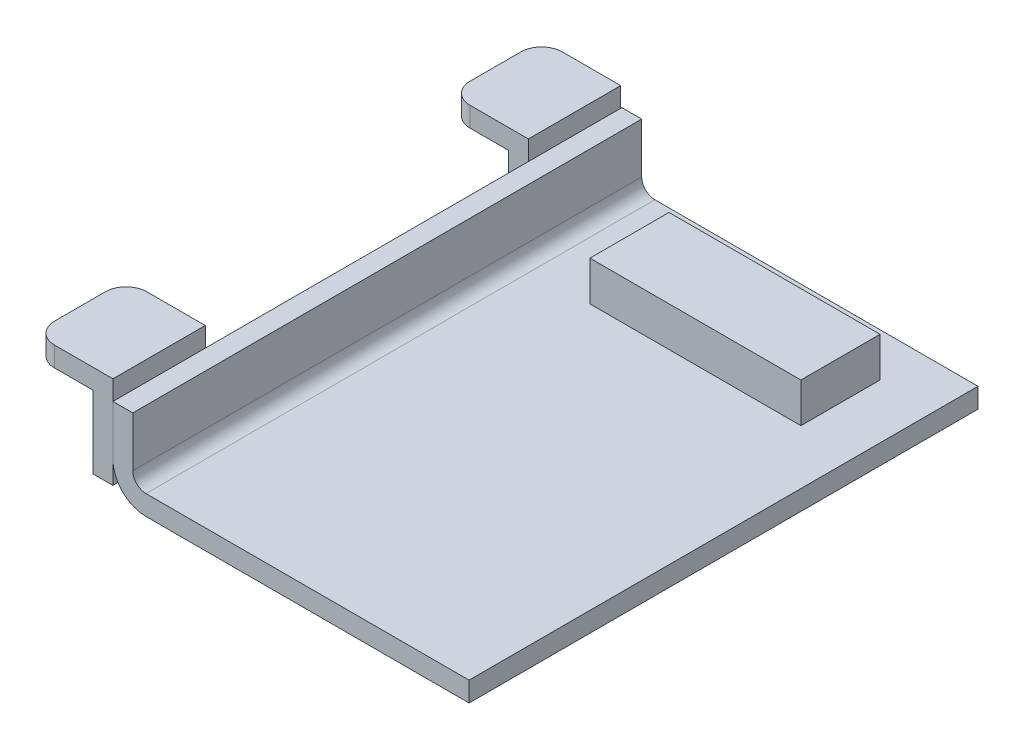
ISO-10303-21;
HEADER;
FILE_DESCRIPTION(('STEP AP214'),'2;1');
FILE_NAME('part.step','',(''),(''),'','','');
FILE_SCHEMA(('AUTOMOTIVE_DESIGN { 1 0 10303 214 1 1 1 1 }'));
ENDSEC;
DATA;
#1=APPLICATION_CONTEXT('core data for automotive mechanical design processes');
#2=APPLICATION_PROTOCOL_DEFINITION('international standard','automotive_design',2000,#1);
#3=PRODUCT_CONTEXT('',#1,'mechanical');
#4=PRODUCT('Part','Part','',(#3));
#5=PRODUCT_RELATED_PRODUCT_CATEGORY('part','',(#4));
#6=PRODUCT_DEFINITION_FORMATION('','',#4);
#7=PRODUCT_DEFINITION_CONTEXT('part definition',#1,'design');
#8=PRODUCT_DEFINITION('design','',#6,#7);
#9=PRODUCT_DEFINITION_SHAPE('','',#8);
#10=(LENGTH_UNIT() NAMED_UNIT(*) SI_UNIT(.MILLI.,.METRE.));
#11=(NAMED_UNIT(*) PLANE_ANGLE_UNIT() SI_UNIT($,.RADIAN.));
#12=(NAMED_UNIT(*) SI_UNIT($,.STERADIAN.) SOLID_ANGLE_UNIT());
#13=UNCERTAINTY_MEASURE_WITH_UNIT(LENGTH_MEASURE(1.E-05),#10,'distance_accuracy_value','');
#14=(GEOMETRIC_REPRESENTATION_CONTEXT(3) GLOBAL_UNCERTAINTY_ASSIGNED_CONTEXT((#13)) GLOBAL_UNIT_ASSIGNED_CONTEXT((#10,
#11,#12)) REPRESENTATION_CONTEXT('',''));
#15=CARTESIAN_POINT('',(0.,0.,0.));
#16=DIRECTION('',(0.,0.,1.));
#17=DIRECTION('',(1.,0.,0.));
#18=AXIS2_PLACEMENT_3D('',#15,#16,#17);
#19=CARTESIAN_POINT('',(-4.7752,2.49989999999999,61.25));
#20=DIRECTION('',(0.,-1.,0.));
#21=DIRECTION('',(1.,0.,0.));
#22=AXIS2_PLACEMENT_3D('',#19,#20,#21);
#23=PLANE('',#22);
#24=DIRECTION('',(-1.,0.,0.));
#25=VECTOR('',#24,1.);
#26=CARTESIAN_POINT('',(-4.7752,2.49989999999999,39.025));
#27=LINE('',#26,#25);
#28=CARTESIAN_POINT('',(0.,2.49989999999999,39.025));
#29=VERTEX_POINT('',#28);
#30=CARTESIAN_POINT('',(-4.7752,2.49989999999999,39.025));
#31=VERTEX_POINT('',#30);
#32=EDGE_CURVE('E145',#29,#31,#27,.T.);
#33=ORIENTED_EDGE('',*,*,#32,.F.);
#34=DIRECTION('',(0.,0.,-1.));
#35=VECTOR('',#34,1.);
#36=CARTESIAN_POINT('',(0.,2.49989999999999,61.25));
#37=LINE('',#36,#35);
#38=CARTESIAN_POINT('',(0.,2.49989999999999,61.25));
#39=VERTEX_POINT('',#38);
#40=EDGE_CURVE('E134',#39,#29,#37,.T.);
#41=ORIENTED_EDGE('',*,*,#40,.F.);
#42=DIRECTION('',(-1.,0.,0.));
#43=VECTOR('',#42,1.);
#44=CARTESIAN_POINT('',(-4.7752,2.49989999999999,61.25));
#45=LINE('',#44,#43);
#46=CARTESIAN_POINT('',(-4.7752,2.49989999999999,61.25));
#47=VERTEX_POINT('',#46);
#48=EDGE_CURVE('E130',#39,#47,#45,.T.);
#49=ORIENTED_EDGE('',*,*,#48,.T.);
#50=DIRECTION('',(0.,0.,-1.));
#51=VECTOR('',#50,1.);
#52=CARTESIAN_POINT('',(-4.7752,2.49989999999999,61.25));
#53=LINE('',#52,#51);
#54=EDGE_CURVE('E114',#47,#31,#53,.T.);
#55=ORIENTED_EDGE('',*,*,#54,.T.);
#56=EDGE_LOOP('',(#33,#41,#49,#55));
#57=FACE_BOUND('',#56,.T.);
#58=ADVANCED_FACE('F45',(#57),#23,.T.);
#59=CARTESIAN_POINT('',(0.,2.49989999999999,61.25));
#60=DIRECTION('',(1.,0.,0.));
#61=DIRECTION('',(0.,0.,-1.));
#62=AXIS2_PLACEMENT_3D('',#59,#60,#61);
#63=PLANE('',#62);
#64=DIRECTION('',(0.,-1.,0.));
#65=VECTOR('',#64,1.);
#66=CARTESIAN_POINT('',(0.,2.49989999999999,39.025));
#67=LINE('',#66,#65);
#68=CARTESIAN_POINT('',(0.,24.7249,39.025));
#69=VERTEX_POINT('',#68);
#70=EDGE_CURVE('E135',#69,#29,#67,.T.);
#71=ORIENTED_EDGE('',*,*,#70,.F.);
#72=DIRECTION('',(0.,0.,-1.));
#73=VECTOR('',#72,1.);
#74=CARTESIAN_POINT('',(0.,24.7249,61.25));
#75=LINE('',#74,#73);
#76=CARTESIAN_POINT('',(0.,24.7249,61.25));
#77=VERTEX_POINT('',#76);
#78=EDGE_CURVE('E153',#77,#69,#75,.T.);
#79=ORIENTED_EDGE('',*,*,#78,.F.);
#80=DIRECTION('',(0.,-1.,0.));
#81=VECTOR('',#80,1.);
#82=CARTESIAN_POINT('',(0.,2.49989999999999,61.25));
#83=LINE('',#82,#81);
#84=EDGE_CURVE('E125',#77,#39,#83,.T.);
#85=ORIENTED_EDGE('',*,*,#84,.T.);
#86=ORIENTED_EDGE('',*,*,#40,.T.);
#87=EDGE_LOOP('',(#71,#79,#85,#86));
#88=FACE_BOUND('',#87,.T.);
#89=ADVANCED_FACE('F186',(#88),#63,.T.);
#90=CARTESIAN_POINT('',(0.,24.7249,61.25));
#91=DIRECTION('',(0.,1.,0.));
#92=DIRECTION('',(0.,0.,1.));
#93=AXIS2_PLACEMENT_3D('',#90,#91,#92);
#94=PLANE('',#93);
#95=DIRECTION('',(0.,0.,-1.));
#96=VECTOR('',#95,1.);
#97=CARTESIAN_POINT('',(-19.05,24.7249,61.25));
#98=LINE('',#97,#96);
#99=CARTESIAN_POINT('',(-19.05,24.7249,56.25));
#100=VERTEX_POINT('',#99);
#101=CARTESIAN_POINT('',(-19.05,24.7249,44.025));
#102=VERTEX_POINT('',#101);
#103=EDGE_CURVE('E156',#100,#102,#98,.T.);
#104=ORIENTED_EDGE('',*,*,#103,.F.);
#105=CARTESIAN_POINT('',(-14.05,24.7249,56.25));
#106=DIRECTION('',(0.,1.,0.));
#107=DIRECTION('',(0.,0.,1.));
#108=AXIS2_PLACEMENT_3D('',#105,#106,#107);
#109=CIRCLE('',#108,5.);
#110=CARTESIAN_POINT('',(-14.05,24.7249,61.25));
#111=VERTEX_POINT('',#110);
#112=EDGE_CURVE('E168',#100,#111,#109,.T.);
#113=ORIENTED_EDGE('',*,*,#112,.T.);
#114=DIRECTION('',(1.,0.,0.));
#115=VECTOR('',#114,1.);
#116=CARTESIAN_POINT('',(0.,24.7249,61.25));
#117=LINE('',#116,#115);
#118=EDGE_CURVE('E142',#111,#77,#117,.T.);
#119=ORIENTED_EDGE('',*,*,#118,.T.);
#120=ORIENTED_EDGE('',*,*,#78,.T.);
#121=DIRECTION('',(1.,0.,0.));
#122=VECTOR('',#121,1.);
#123=CARTESIAN_POINT('',(0.,24.7249,39.025));
#124=LINE('',#123,#122);
#125=CARTESIAN_POINT('',(-14.05,24.7249,39.025));
#126=VERTEX_POINT('',#125);
#127=EDGE_CURVE('E138',#126,#69,#124,.T.);
#128=ORIENTED_EDGE('',*,*,#127,.F.);
#129=CARTESIAN_POINT('',(-14.05,24.7249,44.025));
#130=DIRECTION('',(0.,1.,0.));
#131=DIRECTION('',(0.,0.,1.));
#132=AXIS2_PLACEMENT_3D('',#129,#130,#131);
#133=CIRCLE('',#132,5.);
#134=EDGE_CURVE('E166',#126,#102,#133,.T.);
#135=ORIENTED_EDGE('',*,*,#134,.T.);
#136=EDGE_LOOP('',(#104,#113,#119,#120,#128,#135));
#137=FACE_BOUND('',#136,.T.);
#138=ADVANCED_FACE('F182',(#137),#94,.T.);
#139=CARTESIAN_POINT('',(-19.05,24.7249,61.25));
#140=DIRECTION('',(-1.,0.,0.));
#141=DIRECTION('',(0.,0.,1.));
#142=AXIS2_PLACEMENT_3D('',#139,#140,#141);
#143=PLANE('',#142);
#144=DIRECTION('',(0.,0.,-1.));
#145=VECTOR('',#144,1.);
#146=CARTESIAN_POINT('',(-19.05,19.9497,61.25));
#147=LINE('',#146,#145);
#148=CARTESIAN_POINT('',(-19.05,19.9497,56.25));
#149=VERTEX_POINT('',#148);
#150=CARTESIAN_POINT('',(-19.05,19.9497,44.025));
#151=VERTEX_POINT('',#150);
#152=EDGE_CURVE('E159',#149,#151,#147,.T.);
#153=ORIENTED_EDGE('',*,*,#152,.F.);
#154=DIRECTION('',(0.,1.,0.));
#155=VECTOR('',#154,1.);
#156=CARTESIAN_POINT('',(-19.05,24.7249,56.25));
#157=LINE('',#156,#155);
#158=EDGE_CURVE('E163',#149,#100,#157,.T.);
#159=ORIENTED_EDGE('',*,*,#158,.T.);
#160=ORIENTED_EDGE('',*,*,#103,.T.);
#161=DIRECTION('',(0.,1.,0.));
#162=VECTOR('',#161,1.);
#163=CARTESIAN_POINT('',(-19.05,24.7249,44.025));
#164=LINE('',#163,#162);
#165=EDGE_CURVE('E152',#102,#151,#164,.F.);
#166=ORIENTED_EDGE('',*,*,#165,.T.);
#167=EDGE_LOOP('',(#153,#159,#160,#166));
#168=FACE_BOUND('',#167,.T.);
#169=ADVANCED_FACE('F177',(#168),#143,.T.);
#170=CARTESIAN_POINT('',(-19.05,19.9497,61.25));
#171=DIRECTION('',(0.,-1.,0.));
#172=DIRECTION('',(1.,0.,0.));
#173=AXIS2_PLACEMENT_3D('',#170,#171,#172);
#174=PLANE('',#173);
#175=DIRECTION('',(-1.,0.,0.));
#176=VECTOR('',#175,1.);
#177=CARTESIAN_POINT('',(-19.05,19.9497,61.25));
#178=LINE('',#177,#176);
#179=CARTESIAN_POINT('',(-4.7752,19.9497,61.25));
#180=VERTEX_POINT('',#179);
#181=CARTESIAN_POINT('',(-14.05,19.9497,61.25));
#182=VERTEX_POINT('',#181);
#183=EDGE_CURVE('E132',#180,#182,#178,.T.);
#184=ORIENTED_EDGE('',*,*,#183,.T.);
#185=CARTESIAN_POINT('',(-14.05,19.9497,56.25));
#186=DIRECTION('',(0.,-1.,0.));
#187=DIRECTION('',(1.,0.,0.));
#188=AXIS2_PLACEMENT_3D('',#185,#186,#187);
#189=CIRCLE('',#188,5.);
#190=EDGE_CURVE('E53',#182,#149,#189,.T.);
#191=ORIENTED_EDGE('',*,*,#190,.T.);
#192=ORIENTED_EDGE('',*,*,#152,.T.);
#193=CARTESIAN_POINT('',(-14.05,19.9497,44.025));
#194=DIRECTION('',(0.,-1.,0.));
#195=DIRECTION('',(1.,0.,0.));
#196=AXIS2_PLACEMENT_3D('',#193,#194,#195);
#197=CIRCLE('',#196,5.);
#198=CARTESIAN_POINT('',(-14.05,19.9497,39.025));
#199=VERTEX_POINT('',#198);
#200=EDGE_CURVE('E60',#151,#199,#197,.T.);
#201=ORIENTED_EDGE('',*,*,#200,.T.);
#202=DIRECTION('',(-1.,0.,0.));
#203=VECTOR('',#202,1.);
#204=CARTESIAN_POINT('',(-19.05,19.9497,39.025));
#205=LINE('',#204,#203);
#206=CARTESIAN_POINT('',(-4.7752,19.9497,39.025));
#207=VERTEX_POINT('',#206);
#208=EDGE_CURVE('E148',#207,#199,#205,.T.);
#209=ORIENTED_EDGE('',*,*,#208,.F.);
#210=DIRECTION('',(0.,0.,-1.));
#211=VECTOR('',#210,1.);
#212=CARTESIAN_POINT('',(-4.7752,19.9497,61.25));
#213=LINE('',#212,#211);
#214=EDGE_CURVE('E124',#180,#207,#213,.T.);
#215=ORIENTED_EDGE('',*,*,#214,.F.);
#216=EDGE_LOOP('',(#184,#191,#192,#201,#209,#215));
#217=FACE_BOUND('',#216,.T.);
#218=ADVANCED_FACE('F173',(#217),#174,.T.);
#219=CARTESIAN_POINT('',(-4.7752,19.9497,61.25));
#220=DIRECTION('',(-1.,0.,0.));
#221=DIRECTION('',(0.,-1.,0.));
#222=AXIS2_PLACEMENT_3D('',#219,#220,#221);
#223=PLANE('',#222);
#224=DIRECTION('',(0.,1.,0.));
#225=VECTOR('',#224,1.);
#226=CARTESIAN_POINT('',(-4.7752,19.9497,39.025));
#227=LINE('',#226,#225);
#228=EDGE_CURVE('E119',#31,#207,#227,.T.);
#229=ORIENTED_EDGE('',*,*,#228,.F.);
#230=ORIENTED_EDGE('',*,*,#54,.F.);
#231=DIRECTION('',(0.,1.,0.));
#232=VECTOR('',#231,1.);
#233=CARTESIAN_POINT('',(-4.7752,19.9497,61.25));
#234=LINE('',#233,#232);
#235=EDGE_CURVE('E117',#47,#180,#234,.T.);
#236=ORIENTED_EDGE('',*,*,#235,.T.);
#237=ORIENTED_EDGE('',*,*,#214,.T.);
#238=EDGE_LOOP('',(#229,#230,#236,#237));
#239=FACE_BOUND('',#238,.T.);
#240=ADVANCED_FACE('F116',(#239),#223,.T.);
#241=CARTESIAN_POINT('',(-4.7752,2.49989999999999,61.25));
#242=DIRECTION('',(0.,0.,-1.));
#243=DIRECTION('',(-1.,0.,0.));
#244=AXIS2_PLACEMENT_3D('',#241,#242,#243);
#245=PLANE('',#244);
#246=ORIENTED_EDGE('',*,*,#118,.F.);
#247=DIRECTION('',(0.,1.,0.));
#248=VECTOR('',#247,1.);
#249=CARTESIAN_POINT('',(-14.05,19.9497,61.25));
#250=LINE('',#249,#248);
#251=EDGE_CURVE('E68',#111,#182,#250,.F.);
#252=ORIENTED_EDGE('',*,*,#251,.T.);
#253=ORIENTED_EDGE('',*,*,#183,.F.);
#254=ORIENTED_EDGE('',*,*,#235,.F.);
#255=ORIENTED_EDGE('',*,*,#48,.F.);
#256=ORIENTED_EDGE('',*,*,#84,.F.);
#257=EDGE_LOOP('',(#246,#252,#253,#254,#255,#256));
#258=FACE_BOUND('',#257,.T.);
#259=ADVANCED_FACE('F128',(#258),#245,.F.);
#260=CARTESIAN_POINT('',(-4.7752,2.49989999999999,39.025));
#261=DIRECTION('',(0.,0.,-1.));
#262=DIRECTION('',(-1.,0.,0.));
#263=AXIS2_PLACEMENT_3D('',#260,#261,#262);
#264=PLANE('',#263);
#265=ORIENTED_EDGE('',*,*,#208,.T.);
#266=DIRECTION('',(0.,1.,0.));
#267=VECTOR('',#266,1.);
#268=CARTESIAN_POINT('',(-14.05,2.49989999999999,39.025));
#269=LINE('',#268,#267);
#270=EDGE_CURVE('E12',#199,#126,#269,.T.);
#271=ORIENTED_EDGE('',*,*,#270,.T.);
#272=ORIENTED_EDGE('',*,*,#127,.T.);
#273=ORIENTED_EDGE('',*,*,#70,.T.);
#274=ORIENTED_EDGE('',*,*,#32,.T.);
#275=ORIENTED_EDGE('',*,*,#228,.T.);
#276=EDGE_LOOP('',(#265,#271,#272,#273,#274,#275));
#277=FACE_BOUND('',#276,.T.);
#278=ADVANCED_FACE('F189',(#277),#264,.T.);
#279=CARTESIAN_POINT('',(-14.05,24.7249,56.25));
#280=DIRECTION('',(0.,-1.,0.));
#281=DIRECTION('',(0.,0.,-1.));
#282=AXIS2_PLACEMENT_3D('',#279,#280,#281);
#283=CYLINDRICAL_SURFACE('',#282,5.);
#284=ORIENTED_EDGE('',*,*,#190,.F.);
#285=ORIENTED_EDGE('',*,*,#251,.F.);
#286=ORIENTED_EDGE('',*,*,#112,.F.);
#287=ORIENTED_EDGE('',*,*,#158,.F.);
#288=EDGE_LOOP('',(#284,#285,#286,#287));
#289=FACE_BOUND('',#288,.T.);
#290=ADVANCED_FACE('F180',(#289),#283,.T.);
#291=CARTESIAN_POINT('',(-14.05,2.49989999999999,44.025));
#292=DIRECTION('',(0.,1.,0.));
#293=DIRECTION('',(0.,0.,1.));
#294=AXIS2_PLACEMENT_3D('',#291,#292,#293);
#295=CYLINDRICAL_SURFACE('',#294,5.);
#296=ORIENTED_EDGE('',*,*,#200,.F.);
#297=ORIENTED_EDGE('',*,*,#165,.F.);
#298=ORIENTED_EDGE('',*,*,#134,.F.);
#299=ORIENTED_EDGE('',*,*,#270,.F.);
#300=EDGE_LOOP('',(#296,#297,#298,#299));
#301=FACE_BOUND('',#300,.T.);
#302=ADVANCED_FACE('F47',(#301),#295,.T.);
#303=CLOSED_SHELL('',(#58,#89,#138,#169,#218,#240,#259,#278,#290,#302));
#304=MANIFOLD_SOLID_BREP('B2',#303);
#305=CARTESIAN_POINT('',(21.8248,14.3002,-50.775));
#306=DIRECTION('',(1.,0.,0.));
#307=DIRECTION('',(0.,0.,-1.));
#308=AXIS2_PLACEMENT_3D('',#305,#306,#307);
#309=PLANE('',#308);
#310=DIRECTION('',(0.,0.,1.));
#311=VECTOR('',#310,1.);
#312=CARTESIAN_POINT('',(21.8248,4.7752,-50.775));
#313=LINE('',#312,#311);
#314=CARTESIAN_POINT('',(21.8248,4.7752,-50.775));
#315=VERTEX_POINT('',#314);
#316=CARTESIAN_POINT('',(21.8248,4.7752,-31.725));
#317=VERTEX_POINT('',#316);
#318=EDGE_CURVE('E365',#315,#317,#313,.T.);
#319=ORIENTED_EDGE('',*,*,#318,.T.);
#320=DIRECTION('',(0.,-1.,0.));
#321=VECTOR('',#320,1.);
#322=CARTESIAN_POINT('',(21.8248,14.3002,-31.725));
#323=LINE('',#322,#321);
#324=CARTESIAN_POINT('',(21.8248,14.3002,-31.725));
#325=VERTEX_POINT('',#324);
#326=EDGE_CURVE('E43',#325,#317,#323,.T.);
#327=ORIENTED_EDGE('',*,*,#326,.F.);
#328=DIRECTION('',(0.,0.,1.));
#329=VECTOR('',#328,1.);
#330=CARTESIAN_POINT('',(21.8248,14.3002,-50.775));
#331=LINE('',#330,#329);
#332=CARTESIAN_POINT('',(21.8248,14.3002,-50.775));
#333=VERTEX_POINT('',#332);
#334=EDGE_CURVE('E353',#333,#325,#331,.T.);
#335=ORIENTED_EDGE('',*,*,#334,.F.);
#336=DIRECTION('',(0.,-1.,0.));
#337=VECTOR('',#336,1.);
#338=CARTESIAN_POINT('',(21.8248,14.3002,-50.775));
#339=LINE('',#338,#337);
#340=EDGE_CURVE('E361',#333,#315,#339,.T.);
#341=ORIENTED_EDGE('',*,*,#340,.T.);
#342=EDGE_LOOP('',(#319,#327,#335,#341));
#343=FACE_BOUND('',#342,.T.);
#344=ADVANCED_FACE('F302',(#343),#309,.F.);
#345=CARTESIAN_POINT('',(21.8248,14.3002,-31.725));
#346=DIRECTION('',(0.,0.,-1.));
#347=DIRECTION('',(-1.,0.,0.));
#348=AXIS2_PLACEMENT_3D('',#345,#346,#347);
#349=PLANE('',#348);
#350=DIRECTION('',(1.,0.,0.));
#351=VECTOR('',#350,1.);
#352=CARTESIAN_POINT('',(21.8248,4.7752,-31.725));
#353=LINE('',#352,#351);
#354=CARTESIAN_POINT('',(72.6248,4.7752,-31.725));
#355=VERTEX_POINT('',#354);
#356=EDGE_CURVE('E357',#317,#355,#353,.T.);
#357=ORIENTED_EDGE('',*,*,#356,.T.);
#358=DIRECTION('',(0.,-1.,0.));
#359=VECTOR('',#358,1.);
#360=CARTESIAN_POINT('',(72.6248,14.3002,-31.725));
#361=LINE('',#360,#359);
#362=CARTESIAN_POINT('',(72.6248,14.3002,-31.725));
#363=VERTEX_POINT('',#362);
#364=EDGE_CURVE('E310',#363,#355,#361,.T.);
#365=ORIENTED_EDGE('',*,*,#364,.F.);
#366=DIRECTION('',(1.,0.,0.));
#367=VECTOR('',#366,1.);
#368=CARTESIAN_POINT('',(21.8248,14.3002,-31.725));
#369=LINE('',#368,#367);
#370=EDGE_CURVE('E348',#325,#363,#369,.T.);
#371=ORIENTED_EDGE('',*,*,#370,.F.);
#372=ORIENTED_EDGE('',*,*,#326,.T.);
#373=EDGE_LOOP('',(#357,#365,#371,#372));
#374=FACE_BOUND('',#373,.T.);
#375=ADVANCED_FACE('F356',(#374),#349,.F.);
#376=CARTESIAN_POINT('',(72.6248,14.3002,-50.775));
#377=DIRECTION('',(-1.,0.,0.));
#378=DIRECTION('',(0.,-1.,0.));
#379=AXIS2_PLACEMENT_3D('',#376,#377,#378);
#380=PLANE('',#379);
#381=DIRECTION('',(0.,0.,-1.));
#382=VECTOR('',#381,1.);
#383=CARTESIAN_POINT('',(72.6248,4.7752,-50.775));
#384=LINE('',#383,#382);
#385=CARTESIAN_POINT('',(72.6248,4.7752,-50.775));
#386=VERTEX_POINT('',#385);
#387=EDGE_CURVE('E335',#355,#386,#384,.T.);
#388=ORIENTED_EDGE('',*,*,#387,.T.);
#389=DIRECTION('',(0.,-1.,0.));
#390=VECTOR('',#389,1.);
#391=CARTESIAN_POINT('',(72.6248,14.3002,-50.775));
#392=LINE('',#391,#390);
#393=CARTESIAN_POINT('',(72.6248,14.3002,-50.775));
#394=VERTEX_POINT('',#393);
#395=EDGE_CURVE('E358',#394,#386,#392,.T.);
#396=ORIENTED_EDGE('',*,*,#395,.F.);
#397=DIRECTION('',(0.,0.,-1.));
#398=VECTOR('',#397,1.);
#399=CARTESIAN_POINT('',(72.6248,14.3002,-50.775));
#400=LINE('',#399,#398);
#401=EDGE_CURVE('E351',#363,#394,#400,.T.);
#402=ORIENTED_EDGE('',*,*,#401,.F.);
#403=ORIENTED_EDGE('',*,*,#364,.T.);
#404=EDGE_LOOP('',(#388,#396,#402,#403));
#405=FACE_BOUND('',#404,.T.);
#406=ADVANCED_FACE('F359',(#405),#380,.F.);
#407=CARTESIAN_POINT('',(21.8248,14.3002,-50.775));
#408=DIRECTION('',(0.,0.,1.));
#409=DIRECTION('',(1.,0.,0.));
#410=AXIS2_PLACEMENT_3D('',#407,#408,#409);
#411=PLANE('',#410);
#412=DIRECTION('',(-1.,0.,0.));
#413=VECTOR('',#412,1.);
#414=CARTESIAN_POINT('',(21.8248,4.7752,-50.775));
#415=LINE('',#414,#413);
#416=EDGE_CURVE('E341',#386,#315,#415,.T.);
#417=ORIENTED_EDGE('',*,*,#416,.T.);
#418=ORIENTED_EDGE('',*,*,#340,.F.);
#419=DIRECTION('',(-1.,0.,0.));
#420=VECTOR('',#419,1.);
#421=CARTESIAN_POINT('',(21.8248,14.3002,-50.775));
#422=LINE('',#421,#420);
#423=EDGE_CURVE('E318',#394,#333,#422,.T.);
#424=ORIENTED_EDGE('',*,*,#423,.F.);
#425=ORIENTED_EDGE('',*,*,#395,.T.);
#426=EDGE_LOOP('',(#417,#418,#424,#425));
#427=FACE_BOUND('',#426,.T.);
#428=ADVANCED_FACE('F372',(#427),#411,.F.);
#429=CARTESIAN_POINT('',(21.8248,14.3002,-31.725));
#430=DIRECTION('',(0.,1.,0.));
#431=DIRECTION('',(-1.,0.,0.));
#432=AXIS2_PLACEMENT_3D('',#429,#430,#431);
#433=PLANE('',#432);
#434=ORIENTED_EDGE('',*,*,#334,.T.);
#435=ORIENTED_EDGE('',*,*,#370,.T.);
#436=ORIENTED_EDGE('',*,*,#401,.T.);
#437=ORIENTED_EDGE('',*,*,#423,.T.);
#438=EDGE_LOOP('',(#434,#435,#436,#437));
#439=FACE_BOUND('',#438,.T.);
#440=ADVANCED_FACE('F349',(#439),#433,.T.);
#441=CARTESIAN_POINT('',(21.8248,4.7752,-31.725));
#442=DIRECTION('',(0.,1.,0.));
#443=DIRECTION('',(-1.,0.,0.));
#444=AXIS2_PLACEMENT_3D('',#441,#442,#443);
#445=PLANE('',#444);
#446=ORIENTED_EDGE('',*,*,#318,.F.);
#447=ORIENTED_EDGE('',*,*,#416,.F.);
#448=ORIENTED_EDGE('',*,*,#387,.F.);
#449=ORIENTED_EDGE('',*,*,#356,.F.);
#450=EDGE_LOOP('',(#446,#447,#448,#449));
#451=FACE_BOUND('',#450,.T.);
#452=ADVANCED_FACE('F375',(#451),#445,.F.);
#453=CLOSED_SHELL('',(#344,#375,#406,#428,#440,#452));
#454=MANIFOLD_SOLID_BREP('B6',#453);
#455=CARTESIAN_POINT('',(-4.7752,2.49989999999999,-38.75));
#456=DIRECTION('',(0.,-1.,0.));
#457=DIRECTION('',(1.,0.,0.));
#458=AXIS2_PLACEMENT_3D('',#455,#456,#457);
#459=PLANE('',#458);
#460=DIRECTION('',(-1.,0.,0.));
#461=VECTOR('',#460,1.);
#462=CARTESIAN_POINT('',(-4.7752,2.49989999999999,-60.975));
#463=LINE('',#462,#461);
#464=CARTESIAN_POINT('',(0.,2.49989999999999,-60.975));
#465=VERTEX_POINT('',#464);
#466=CARTESIAN_POINT('',(-4.7752,2.49989999999999,-60.975));
#467=VERTEX_POINT('',#466);
#468=EDGE_CURVE('E534',#465,#467,#463,.T.);
#469=ORIENTED_EDGE('',*,*,#468,.F.);
#470=DIRECTION('',(0.,0.,-1.));
#471=VECTOR('',#470,1.);
#472=CARTESIAN_POINT('',(0.,2.49989999999999,-38.75));
#473=LINE('',#472,#471);
#474=CARTESIAN_POINT('',(0.,2.49989999999999,-38.75));
#475=VERTEX_POINT('',#474);
#476=EDGE_CURVE('E523',#475,#465,#473,.T.);
#477=ORIENTED_EDGE('',*,*,#476,.F.);
#478=DIRECTION('',(-1.,0.,0.));
#479=VECTOR('',#478,1.);
#480=CARTESIAN_POINT('',(-4.7752,2.49989999999999,-38.75));
#481=LINE('',#480,#479);
#482=CARTESIAN_POINT('',(-4.7752,2.49989999999999,-38.75));
#483=VERTEX_POINT('',#482);
#484=EDGE_CURVE('E519',#475,#483,#481,.T.);
#485=ORIENTED_EDGE('',*,*,#484,.T.);
#486=DIRECTION('',(0.,0.,-1.));
#487=VECTOR('',#486,1.);
#488=CARTESIAN_POINT('',(-4.7752,2.49989999999999,-38.75));
#489=LINE('',#488,#487);
#490=EDGE_CURVE('E503',#483,#467,#489,.T.);
#491=ORIENTED_EDGE('',*,*,#490,.T.);
#492=EDGE_LOOP('',(#469,#477,#485,#491));
#493=FACE_BOUND('',#492,.T.);
#494=ADVANCED_FACE('F434',(#493),#459,.T.);
#495=CARTESIAN_POINT('',(0.,2.49989999999999,-38.75));
#496=DIRECTION('',(1.,0.,0.));
#497=DIRECTION('',(0.,0.,-1.));
#498=AXIS2_PLACEMENT_3D('',#495,#496,#497);
#499=PLANE('',#498);
#500=DIRECTION('',(0.,-1.,0.));
#501=VECTOR('',#500,1.);
#502=CARTESIAN_POINT('',(0.,2.49989999999999,-60.975));
#503=LINE('',#502,#501);
#504=CARTESIAN_POINT('',(0.,24.7249,-60.975));
#505=VERTEX_POINT('',#504);
#506=EDGE_CURVE('E524',#505,#465,#503,.T.);
#507=ORIENTED_EDGE('',*,*,#506,.F.);
#508=DIRECTION('',(0.,0.,-1.));
#509=VECTOR('',#508,1.);
#510=CARTESIAN_POINT('',(0.,24.7249,-38.75));
#511=LINE('',#510,#509);
#512=CARTESIAN_POINT('',(0.,24.7249,-38.75));
#513=VERTEX_POINT('',#512);
#514=EDGE_CURVE('E542',#513,#505,#511,.T.);
#515=ORIENTED_EDGE('',*,*,#514,.F.);
#516=DIRECTION('',(0.,-1.,0.));
#517=VECTOR('',#516,1.);
#518=CARTESIAN_POINT('',(0.,2.49989999999999,-38.75));
#519=LINE('',#518,#517);
#520=EDGE_CURVE('E514',#513,#475,#519,.T.);
#521=ORIENTED_EDGE('',*,*,#520,.T.);
#522=ORIENTED_EDGE('',*,*,#476,.T.);
#523=EDGE_LOOP('',(#507,#515,#521,#522));
#524=FACE_BOUND('',#523,.T.);
#525=ADVANCED_FACE('F575',(#524),#499,.T.);
#526=CARTESIAN_POINT('',(0.,24.7249,-38.75));
#527=DIRECTION('',(0.,1.,0.));
#528=DIRECTION('',(0.,0.,1.));
#529=AXIS2_PLACEMENT_3D('',#526,#527,#528);
#530=PLANE('',#529);
#531=DIRECTION('',(0.,0.,-1.));
#532=VECTOR('',#531,1.);
#533=CARTESIAN_POINT('',(-19.05,24.7249,-38.75));
#534=LINE('',#533,#532);
#535=CARTESIAN_POINT('',(-19.05,24.7249,-43.75));
#536=VERTEX_POINT('',#535);
#537=CARTESIAN_POINT('',(-19.05,24.7249,-55.975));
#538=VERTEX_POINT('',#537);
#539=EDGE_CURVE('E545',#536,#538,#534,.T.);
#540=ORIENTED_EDGE('',*,*,#539,.F.);
#541=CARTESIAN_POINT('',(-14.05,24.7249,-43.75));
#542=DIRECTION('',(0.,1.,0.));
#543=DIRECTION('',(0.,0.,1.));
#544=AXIS2_PLACEMENT_3D('',#541,#542,#543);
#545=CIRCLE('',#544,5.);
#546=CARTESIAN_POINT('',(-14.05,24.7249,-38.75));
#547=VERTEX_POINT('',#546);
#548=EDGE_CURVE('E557',#536,#547,#545,.T.);
#549=ORIENTED_EDGE('',*,*,#548,.T.);
#550=DIRECTION('',(1.,0.,0.));
#551=VECTOR('',#550,1.);
#552=CARTESIAN_POINT('',(0.,24.7249,-38.75));
#553=LINE('',#552,#551);
#554=EDGE_CURVE('E531',#547,#513,#553,.T.);
#555=ORIENTED_EDGE('',*,*,#554,.T.);
#556=ORIENTED_EDGE('',*,*,#514,.T.);
#557=DIRECTION('',(1.,0.,0.));
#558=VECTOR('',#557,1.);
#559=CARTESIAN_POINT('',(0.,24.7249,-60.975));
#560=LINE('',#559,#558);
#561=CARTESIAN_POINT('',(-14.05,24.7249,-60.975));
#562=VERTEX_POINT('',#561);
#563=EDGE_CURVE('E527',#562,#505,#560,.T.);
#564=ORIENTED_EDGE('',*,*,#563,.F.);
#565=CARTESIAN_POINT('',(-14.05,24.7249,-55.975));
#566=DIRECTION('',(0.,1.,0.));
#567=DIRECTION('',(0.,0.,1.));
#568=AXIS2_PLACEMENT_3D('',#565,#566,#567);
#569=CIRCLE('',#568,5.);
#570=EDGE_CURVE('E555',#562,#538,#569,.T.);
#571=ORIENTED_EDGE('',*,*,#570,.T.);
#572=EDGE_LOOP('',(#540,#549,#555,#556,#564,#571));
#573=FACE_BOUND('',#572,.T.);
#574=ADVANCED_FACE('F571',(#573),#530,.T.);
#575=CARTESIAN_POINT('',(-19.05,24.7249,-38.75));
#576=DIRECTION('',(-1.,0.,0.));
#577=DIRECTION('',(0.,0.,1.));
#578=AXIS2_PLACEMENT_3D('',#575,#576,#577);
#579=PLANE('',#578);
#580=DIRECTION('',(0.,0.,-1.));
#581=VECTOR('',#580,1.);
#582=CARTESIAN_POINT('',(-19.05,19.9497,-38.75));
#583=LINE('',#582,#581);
#584=CARTESIAN_POINT('',(-19.05,19.9497,-43.75));
#585=VERTEX_POINT('',#584);
#586=CARTESIAN_POINT('',(-19.05,19.9497,-55.975));
#587=VERTEX_POINT('',#586);
#588=EDGE_CURVE('E548',#585,#587,#583,.T.);
#589=ORIENTED_EDGE('',*,*,#588,.F.);
#590=DIRECTION('',(0.,1.,0.));
#591=VECTOR('',#590,1.);
#592=CARTESIAN_POINT('',(-19.05,24.7249,-43.75));
#593=LINE('',#592,#591);
#594=EDGE_CURVE('E552',#585,#536,#593,.T.);
#595=ORIENTED_EDGE('',*,*,#594,.T.);
#596=ORIENTED_EDGE('',*,*,#539,.T.);
#597=DIRECTION('',(0.,1.,0.));
#598=VECTOR('',#597,1.);
#599=CARTESIAN_POINT('',(-19.05,24.7249,-55.975));
#600=LINE('',#599,#598);
#601=EDGE_CURVE('E541',#538,#587,#600,.F.);
#602=ORIENTED_EDGE('',*,*,#601,.T.);
#603=EDGE_LOOP('',(#589,#595,#596,#602));
#604=FACE_BOUND('',#603,.T.);
#605=ADVANCED_FACE('F566',(#604),#579,.T.);
#606=CARTESIAN_POINT('',(-19.05,19.9497,-38.75));
#607=DIRECTION('',(0.,-1.,0.));
#608=DIRECTION('',(1.,0.,0.));
#609=AXIS2_PLACEMENT_3D('',#606,#607,#608);
#610=PLANE('',#609);
#611=DIRECTION('',(-1.,0.,0.));
#612=VECTOR('',#611,1.);
#613=CARTESIAN_POINT('',(-19.05,19.9497,-38.75));
#614=LINE('',#613,#612);
#615=CARTESIAN_POINT('',(-4.7752,19.9497,-38.75));
#616=VERTEX_POINT('',#615);
#617=CARTESIAN_POINT('',(-14.05,19.9497,-38.75));
#618=VERTEX_POINT('',#617);
#619=EDGE_CURVE('E521',#616,#618,#614,.T.);
#620=ORIENTED_EDGE('',*,*,#619,.T.);
#621=CARTESIAN_POINT('',(-14.05,19.9497,-43.75));
#622=DIRECTION('',(0.,-1.,0.));
#623=DIRECTION('',(1.,0.,0.));
#624=AXIS2_PLACEMENT_3D('',#621,#622,#623);
#625=CIRCLE('',#624,5.);
#626=EDGE_CURVE('E442',#618,#585,#625,.T.);
#627=ORIENTED_EDGE('',*,*,#626,.T.);
#628=ORIENTED_EDGE('',*,*,#588,.T.);
#629=CARTESIAN_POINT('',(-14.05,19.9497,-55.975));
#630=DIRECTION('',(0.,-1.,0.));
#631=DIRECTION('',(1.,0.,0.));
#632=AXIS2_PLACEMENT_3D('',#629,#630,#631);
#633=CIRCLE('',#632,5.);
#634=CARTESIAN_POINT('',(-14.05,19.9497,-60.975));
#635=VERTEX_POINT('',#634);
#636=EDGE_CURVE('E449',#587,#635,#633,.T.);
#637=ORIENTED_EDGE('',*,*,#636,.T.);
#638=DIRECTION('',(-1.,0.,0.));
#639=VECTOR('',#638,1.);
#640=CARTESIAN_POINT('',(-19.05,19.9497,-60.975));
#641=LINE('',#640,#639);
#642=CARTESIAN_POINT('',(-4.7752,19.9497,-60.975));
#643=VERTEX_POINT('',#642);
#644=EDGE_CURVE('E537',#643,#635,#641,.T.);
#645=ORIENTED_EDGE('',*,*,#644,.F.);
#646=DIRECTION('',(0.,0.,-1.));
#647=VECTOR('',#646,1.);
#648=CARTESIAN_POINT('',(-4.7752,19.9497,-38.75));
#649=LINE('',#648,#647);
#650=EDGE_CURVE('E513',#616,#643,#649,.T.);
#651=ORIENTED_EDGE('',*,*,#650,.F.);
#652=EDGE_LOOP('',(#620,#627,#628,#637,#645,#651));
#653=FACE_BOUND('',#652,.T.);
#654=ADVANCED_FACE('F562',(#653),#610,.T.);
#655=CARTESIAN_POINT('',(-4.7752,19.9497,-38.75));
#656=DIRECTION('',(-1.,0.,0.));
#657=DIRECTION('',(0.,-1.,0.));
#658=AXIS2_PLACEMENT_3D('',#655,#656,#657);
#659=PLANE('',#658);
#660=DIRECTION('',(0.,1.,0.));
#661=VECTOR('',#660,1.);
#662=CARTESIAN_POINT('',(-4.7752,19.9497,-60.975));
#663=LINE('',#662,#661);
#664=EDGE_CURVE('E508',#467,#643,#663,.T.);
#665=ORIENTED_EDGE('',*,*,#664,.F.);
#666=ORIENTED_EDGE('',*,*,#490,.F.);
#667=DIRECTION('',(0.,1.,0.));
#668=VECTOR('',#667,1.);
#669=CARTESIAN_POINT('',(-4.7752,19.9497,-38.75));
#670=LINE('',#669,#668);
#671=EDGE_CURVE('E506',#483,#616,#670,.T.);
#672=ORIENTED_EDGE('',*,*,#671,.T.);
#673=ORIENTED_EDGE('',*,*,#650,.T.);
#674=EDGE_LOOP('',(#665,#666,#672,#673));
#675=FACE_BOUND('',#674,.T.);
#676=ADVANCED_FACE('F505',(#675),#659,.T.);
#677=CARTESIAN_POINT('',(-4.7752,2.49989999999999,-38.75));
#678=DIRECTION('',(0.,0.,-1.));
#679=DIRECTION('',(-1.,0.,0.));
#680=AXIS2_PLACEMENT_3D('',#677,#678,#679);
#681=PLANE('',#680);
#682=ORIENTED_EDGE('',*,*,#554,.F.);
#683=DIRECTION('',(0.,1.,0.));
#684=VECTOR('',#683,1.);
#685=CARTESIAN_POINT('',(-14.05,19.9497,-38.75));
#686=LINE('',#685,#684);
#687=EDGE_CURVE('E457',#547,#618,#686,.F.);
#688=ORIENTED_EDGE('',*,*,#687,.T.);
#689=ORIENTED_EDGE('',*,*,#619,.F.);
#690=ORIENTED_EDGE('',*,*,#671,.F.);
#691=ORIENTED_EDGE('',*,*,#484,.F.);
#692=ORIENTED_EDGE('',*,*,#520,.F.);
#693=EDGE_LOOP('',(#682,#688,#689,#690,#691,#692));
#694=FACE_BOUND('',#693,.T.);
#695=ADVANCED_FACE('F517',(#694),#681,.F.);
#696=CARTESIAN_POINT('',(-4.7752,2.49989999999999,-60.975));
#697=DIRECTION('',(0.,0.,-1.));
#698=DIRECTION('',(-1.,0.,0.));
#699=AXIS2_PLACEMENT_3D('',#696,#697,#698);
#700=PLANE('',#699);
#701=ORIENTED_EDGE('',*,*,#644,.T.);
#702=DIRECTION('',(0.,1.,0.));
#703=VECTOR('',#702,1.);
#704=CARTESIAN_POINT('',(-14.05,2.49989999999999,-60.975));
#705=LINE('',#704,#703);
#706=EDGE_CURVE('E300',#635,#562,#705,.T.);
#707=ORIENTED_EDGE('',*,*,#706,.T.);
#708=ORIENTED_EDGE('',*,*,#563,.T.);
#709=ORIENTED_EDGE('',*,*,#506,.T.);
#710=ORIENTED_EDGE('',*,*,#468,.T.);
#711=ORIENTED_EDGE('',*,*,#664,.T.);
#712=EDGE_LOOP('',(#701,#707,#708,#709,#710,#711));
#713=FACE_BOUND('',#712,.T.);
#714=ADVANCED_FACE('F578',(#713),#700,.T.);
#715=CARTESIAN_POINT('',(-14.05,24.7249,-43.75));
#716=DIRECTION('',(0.,-1.,0.));
#717=DIRECTION('',(0.,0.,-1.));
#718=AXIS2_PLACEMENT_3D('',#715,#716,#717);
#719=CYLINDRICAL_SURFACE('',#718,5.);
#720=ORIENTED_EDGE('',*,*,#626,.F.);
#721=ORIENTED_EDGE('',*,*,#687,.F.);
#722=ORIENTED_EDGE('',*,*,#548,.F.);
#723=ORIENTED_EDGE('',*,*,#594,.F.);
#724=EDGE_LOOP('',(#720,#721,#722,#723));
#725=FACE_BOUND('',#724,.T.);
#726=ADVANCED_FACE('F569',(#725),#719,.T.);
#727=CARTESIAN_POINT('',(-14.05,2.49989999999999,-55.975));
#728=DIRECTION('',(0.,1.,0.));
#729=DIRECTION('',(0.,0.,1.));
#730=AXIS2_PLACEMENT_3D('',#727,#728,#729);
#731=CYLINDRICAL_SURFACE('',#730,5.);
#732=ORIENTED_EDGE('',*,*,#636,.F.);
#733=ORIENTED_EDGE('',*,*,#601,.F.);
#734=ORIENTED_EDGE('',*,*,#570,.F.);
#735=ORIENTED_EDGE('',*,*,#706,.F.);
#736=EDGE_LOOP('',(#732,#733,#734,#735));
#737=FACE_BOUND('',#736,.T.);
#738=ADVANCED_FACE('F436',(#737),#731,.T.);
#739=CLOSED_SHELL('',(#494,#525,#574,#605,#654,#676,#695,#714,#726,#738));
#740=MANIFOLD_SOLID_BREP('B37',#739);
#741=CARTESIAN_POINT('',(85.725,0.,-61.25));
#742=DIRECTION('',(0.,-1.,0.));
#743=DIRECTION('',(1.,0.,0.));
#744=AXIS2_PLACEMENT_3D('',#741,#742,#743);
#745=PLANE('',#744);
#746=DIRECTION('',(1.,0.,0.));
#747=VECTOR('',#746,1.);
#748=CARTESIAN_POINT('',(85.725,0.,61.25));
#749=LINE('',#748,#747);
#750=CARTESIAN_POINT('',(7.9375,0.,61.25));
#751=VERTEX_POINT('',#750);
#752=CARTESIAN_POINT('',(85.725,0.,61.25));
#753=VERTEX_POINT('',#752);
#754=EDGE_CURVE('E722',#751,#753,#749,.T.);
#755=ORIENTED_EDGE('',*,*,#754,.F.);
#756=DIRECTION('',(0.,0.,1.));
#757=VECTOR('',#756,1.);
#758=CARTESIAN_POINT('',(7.9375,0.,-61.25));
#759=LINE('',#758,#757);
#760=CARTESIAN_POINT('',(7.9375,0.,-61.25));
#761=VERTEX_POINT('',#760);
#762=EDGE_CURVE('E669',#751,#761,#759,.F.);
#763=ORIENTED_EDGE('',*,*,#762,.T.);
#764=DIRECTION('',(1.,0.,0.));
#765=VECTOR('',#764,1.);
#766=CARTESIAN_POINT('',(85.725,0.,-61.25));
#767=LINE('',#766,#765);
#768=CARTESIAN_POINT('',(85.725,0.,-61.25));
#769=VERTEX_POINT('',#768);
#770=EDGE_CURVE('E732',#761,#769,#767,.T.);
#771=ORIENTED_EDGE('',*,*,#770,.T.);
#772=DIRECTION('',(0.,0.,1.));
#773=VECTOR('',#772,1.);
#774=CARTESIAN_POINT('',(85.725,0.,-61.25));
#775=LINE('',#774,#773);
#776=EDGE_CURVE('E731',#769,#753,#775,.T.);
#777=ORIENTED_EDGE('',*,*,#776,.T.);
#778=EDGE_LOOP('',(#755,#763,#771,#777));
#779=FACE_BOUND('',#778,.T.);
#780=ADVANCED_FACE('F661',(#779),#745,.T.);
#781=CARTESIAN_POINT('',(0.,0.,-61.25));
#782=DIRECTION('',(-1.,0.,0.));
#783=DIRECTION('',(0.,0.,1.));
#784=AXIS2_PLACEMENT_3D('',#781,#782,#783);
#785=PLANE('',#784);
#786=DIRECTION('',(0.,-1.,0.));
#787=VECTOR('',#786,1.);
#788=CARTESIAN_POINT('',(0.,0.,-61.25));
#789=LINE('',#788,#787);
#790=CARTESIAN_POINT('',(0.,20.,-61.25));
#791=VERTEX_POINT('',#790);
#792=CARTESIAN_POINT('',(0.,7.9375,-61.25));
#793=VERTEX_POINT('',#792);
#794=EDGE_CURVE('E737',#791,#793,#789,.T.);
#795=ORIENTED_EDGE('',*,*,#794,.T.);
#796=DIRECTION('',(0.,0.,1.));
#797=VECTOR('',#796,1.);
#798=CARTESIAN_POINT('',(0.,7.9375,-61.25));
#799=LINE('',#798,#797);
#800=CARTESIAN_POINT('',(0.,7.9375,61.25));
#801=VERTEX_POINT('',#800);
#802=EDGE_CURVE('E779',#793,#801,#799,.T.);
#803=ORIENTED_EDGE('',*,*,#802,.T.);
#804=DIRECTION('',(0.,-1.,0.));
#805=VECTOR('',#804,1.);
#806=CARTESIAN_POINT('',(0.,0.,61.25));
#807=LINE('',#806,#805);
#808=CARTESIAN_POINT('',(0.,20.,61.25));
#809=VERTEX_POINT('',#808);
#810=EDGE_CURVE('E749',#809,#801,#807,.T.);
#811=ORIENTED_EDGE('',*,*,#810,.F.);
#812=DIRECTION('',(0.,0.,1.));
#813=VECTOR('',#812,1.);
#814=CARTESIAN_POINT('',(0.,20.,-61.25));
#815=LINE('',#814,#813);
#816=EDGE_CURVE('E764',#791,#809,#815,.T.);
#817=ORIENTED_EDGE('',*,*,#816,.F.);
#818=EDGE_LOOP('',(#795,#803,#811,#817));
#819=FACE_BOUND('',#818,.T.);
#820=ADVANCED_FACE('F785',(#819),#785,.T.);
#821=CARTESIAN_POINT('',(0.,20.,-61.25));
#822=DIRECTION('',(0.,1.,0.));
#823=DIRECTION('',(0.,0.,1.));
#824=AXIS2_PLACEMENT_3D('',#821,#822,#823);
#825=PLANE('',#824);
#826=ORIENTED_EDGE('',*,*,#816,.T.);
#827=DIRECTION('',(-1.,0.,0.));
#828=VECTOR('',#827,1.);
#829=CARTESIAN_POINT('',(0.,20.,61.25));
#830=LINE('',#829,#828);
#831=CARTESIAN_POINT('',(4.7752,20.,61.25));
#832=VERTEX_POINT('',#831);
#833=EDGE_CURVE('E746',#832,#809,#830,.T.);
#834=ORIENTED_EDGE('',*,*,#833,.F.);
#835=DIRECTION('',(0.,0.,1.));
#836=VECTOR('',#835,1.);
#837=CARTESIAN_POINT('',(4.7752,20.,-61.25));
#838=LINE('',#837,#836);
#839=CARTESIAN_POINT('',(4.7752,20.,-61.25));
#840=VERTEX_POINT('',#839);
#841=EDGE_CURVE('E767',#840,#832,#838,.T.);
#842=ORIENTED_EDGE('',*,*,#841,.F.);
#843=DIRECTION('',(-1.,0.,0.));
#844=VECTOR('',#843,1.);
#845=CARTESIAN_POINT('',(0.,20.,-61.25));
#846=LINE('',#845,#844);
#847=EDGE_CURVE('E759',#840,#791,#846,.T.);
#848=ORIENTED_EDGE('',*,*,#847,.T.);
#849=EDGE_LOOP('',(#826,#834,#842,#848));
#850=FACE_BOUND('',#849,.T.);
#851=ADVANCED_FACE('F793',(#850),#825,.T.);
#852=CARTESIAN_POINT('',(4.7752,20.,-61.25));
#853=DIRECTION('',(1.,0.,0.));
#854=DIRECTION('',(0.,1.,0.));
#855=AXIS2_PLACEMENT_3D('',#852,#853,#854);
#856=PLANE('',#855);
#857=DIRECTION('',(0.,1.,0.));
#858=VECTOR('',#857,1.);
#859=CARTESIAN_POINT('',(4.7752,20.,61.25));
#860=LINE('',#859,#858);
#861=CARTESIAN_POINT('',(4.7752,7.9502,61.25));
#862=VERTEX_POINT('',#861);
#863=EDGE_CURVE('E742',#862,#832,#860,.T.);
#864=ORIENTED_EDGE('',*,*,#863,.F.);
#865=DIRECTION('',(0.,0.,1.));
#866=VECTOR('',#865,1.);
#867=CARTESIAN_POINT('',(4.7752,7.9502,-61.25));
#868=LINE('',#867,#866);
#869=CARTESIAN_POINT('',(4.7752,7.9502,-61.25));
#870=VERTEX_POINT('',#869);
#871=EDGE_CURVE('E773',#862,#870,#868,.F.);
#872=ORIENTED_EDGE('',*,*,#871,.T.);
#873=DIRECTION('',(0.,1.,0.));
#874=VECTOR('',#873,1.);
#875=CARTESIAN_POINT('',(4.7752,20.,-61.25));
#876=LINE('',#875,#874);
#877=EDGE_CURVE('E757',#870,#840,#876,.T.);
#878=ORIENTED_EDGE('',*,*,#877,.T.);
#879=ORIENTED_EDGE('',*,*,#841,.T.);
#880=EDGE_LOOP('',(#864,#872,#878,#879));
#881=FACE_BOUND('',#880,.T.);
#882=ADVANCED_FACE('F816',(#881),#856,.T.);
#883=CARTESIAN_POINT('',(4.7752,4.7752,-61.25));
#884=DIRECTION('',(0.,1.,0.));
#885=DIRECTION('',(-1.,0.,0.));
#886=AXIS2_PLACEMENT_3D('',#883,#884,#885);
#887=PLANE('',#886);
#888=DIRECTION('',(-1.,0.,0.));
#889=VECTOR('',#888,1.);
#890=CARTESIAN_POINT('',(4.7752,4.7752,-61.25));
#891=LINE('',#890,#889);
#892=CARTESIAN_POINT('',(85.725,4.77519999999999,-61.25));
#893=VERTEX_POINT('',#892);
#894=CARTESIAN_POINT('',(7.9502,4.7752,-61.25));
#895=VERTEX_POINT('',#894);
#896=EDGE_CURVE('E754',#893,#895,#891,.T.);
#897=ORIENTED_EDGE('',*,*,#896,.T.);
#898=DIRECTION('',(0.,0.,1.));
#899=VECTOR('',#898,1.);
#900=CARTESIAN_POINT('',(7.9502,4.7752,61.25));
#901=LINE('',#900,#899);
#902=CARTESIAN_POINT('',(7.9502,4.7752,61.25));
#903=VERTEX_POINT('',#902);
#904=EDGE_CURVE('E766',#895,#903,#901,.T.);
#905=ORIENTED_EDGE('',*,*,#904,.T.);
#906=DIRECTION('',(-1.,0.,0.));
#907=VECTOR('',#906,1.);
#908=CARTESIAN_POINT('',(4.7752,4.7752,61.25));
#909=LINE('',#908,#907);
#910=CARTESIAN_POINT('',(85.725,4.77519999999999,61.25));
#911=VERTEX_POINT('',#910);
#912=EDGE_CURVE('E740',#911,#903,#909,.T.);
#913=ORIENTED_EDGE('',*,*,#912,.F.);
#914=DIRECTION('',(0.,0.,1.));
#915=VECTOR('',#914,1.);
#916=CARTESIAN_POINT('',(85.725,4.77519999999999,-61.25));
#917=LINE('',#916,#915);
#918=EDGE_CURVE('E736',#893,#911,#917,.T.);
#919=ORIENTED_EDGE('',*,*,#918,.F.);
#920=EDGE_LOOP('',(#897,#905,#913,#919));
#921=FACE_BOUND('',#920,.T.);
#922=ADVANCED_FACE('F813',(#921),#887,.T.);
#923=CARTESIAN_POINT('',(85.725,4.77519999999999,-61.25));
#924=DIRECTION('',(1.,0.,0.));
#925=DIRECTION('',(0.,0.,-1.));
#926=AXIS2_PLACEMENT_3D('',#923,#924,#925);
#927=PLANE('',#926);
#928=ORIENTED_EDGE('',*,*,#918,.T.);
#929=DIRECTION('',(0.,1.,0.));
#930=VECTOR('',#929,1.);
#931=CARTESIAN_POINT('',(85.725,4.77519999999999,61.25));
#932=LINE('',#931,#930);
#933=EDGE_CURVE('E727',#753,#911,#932,.T.);
#934=ORIENTED_EDGE('',*,*,#933,.F.);
#935=ORIENTED_EDGE('',*,*,#776,.F.);
#936=DIRECTION('',(0.,1.,0.));
#937=VECTOR('',#936,1.);
#938=CARTESIAN_POINT('',(85.725,4.77519999999999,-61.25));
#939=LINE('',#938,#937);
#940=EDGE_CURVE('E752',#769,#893,#939,.T.);
#941=ORIENTED_EDGE('',*,*,#940,.T.);
#942=EDGE_LOOP('',(#928,#934,#935,#941));
#943=FACE_BOUND('',#942,.T.);
#944=ADVANCED_FACE('F739',(#943),#927,.T.);
#945=CARTESIAN_POINT('',(0.,0.,-61.25));
#946=DIRECTION('',(0.,0.,-1.));
#947=DIRECTION('',(-1.,0.,0.));
#948=AXIS2_PLACEMENT_3D('',#945,#946,#947);
#949=PLANE('',#948);
#950=ORIENTED_EDGE('',*,*,#770,.F.);
#951=CARTESIAN_POINT('',(7.9375,7.9375,-61.25));
#952=DIRECTION('',(0.,0.,-1.));
#953=DIRECTION('',(-1.,0.,0.));
#954=AXIS2_PLACEMENT_3D('',#951,#952,#953);
#955=CIRCLE('',#954,7.9375);
#956=EDGE_CURVE('E432',#761,#793,#955,.T.);
#957=ORIENTED_EDGE('',*,*,#956,.T.);
#958=ORIENTED_EDGE('',*,*,#794,.F.);
#959=ORIENTED_EDGE('',*,*,#847,.F.);
#960=ORIENTED_EDGE('',*,*,#877,.F.);
#961=CARTESIAN_POINT('',(7.9502,7.9502,-61.25));
#962=DIRECTION('',(0.,0.,-1.));
#963=DIRECTION('',(-1.,0.,0.));
#964=AXIS2_PLACEMENT_3D('',#961,#962,#963);
#965=CIRCLE('',#964,3.175);
#966=EDGE_CURVE('E777',#870,#895,#965,.F.);
#967=ORIENTED_EDGE('',*,*,#966,.T.);
#968=ORIENTED_EDGE('',*,*,#896,.F.);
#969=ORIENTED_EDGE('',*,*,#940,.F.);
#970=EDGE_LOOP('',(#950,#957,#958,#959,#960,#967,#968,#969));
#971=FACE_BOUND('',#970,.T.);
#972=ADVANCED_FACE('F797',(#971),#949,.T.);
#973=CARTESIAN_POINT('',(0.,0.,61.25));
#974=DIRECTION('',(0.,0.,-1.));
#975=DIRECTION('',(-1.,0.,0.));
#976=AXIS2_PLACEMENT_3D('',#973,#974,#975);
#977=PLANE('',#976);
#978=ORIENTED_EDGE('',*,*,#810,.T.);
#979=CARTESIAN_POINT('',(7.9375,7.9375,61.25));
#980=DIRECTION('',(0.,0.,-1.));
#981=DIRECTION('',(-1.,0.,0.));
#982=AXIS2_PLACEMENT_3D('',#979,#980,#981);
#983=CIRCLE('',#982,7.9375);
#984=EDGE_CURVE('E683',#801,#751,#983,.F.);
#985=ORIENTED_EDGE('',*,*,#984,.T.);
#986=ORIENTED_EDGE('',*,*,#754,.T.);
#987=ORIENTED_EDGE('',*,*,#933,.T.);
#988=ORIENTED_EDGE('',*,*,#912,.T.);
#989=CARTESIAN_POINT('',(7.9502,7.9502,61.25));
#990=DIRECTION('',(0.,0.,-1.));
#991=DIRECTION('',(-1.,0.,0.));
#992=AXIS2_PLACEMENT_3D('',#989,#990,#991);
#993=CIRCLE('',#992,3.175);
#994=EDGE_CURVE('E775',#903,#862,#993,.T.);
#995=ORIENTED_EDGE('',*,*,#994,.T.);
#996=ORIENTED_EDGE('',*,*,#863,.T.);
#997=ORIENTED_EDGE('',*,*,#833,.T.);
#998=EDGE_LOOP('',(#978,#985,#986,#987,#988,#995,#996,#997));
#999=FACE_BOUND('',#998,.T.);
#1000=ADVANCED_FACE('F724',(#999),#977,.F.);
#1001=CARTESIAN_POINT('',(7.9502,7.9502,-61.25));
#1002=DIRECTION('',(0.,0.,-1.));
#1003=DIRECTION('',(-1.,0.,0.));
#1004=AXIS2_PLACEMENT_3D('',#1001,#1002,#1003);
#1005=CYLINDRICAL_SURFACE('',#1004,3.175);
#1006=ORIENTED_EDGE('',*,*,#966,.F.);
#1007=ORIENTED_EDGE('',*,*,#871,.F.);
#1008=ORIENTED_EDGE('',*,*,#994,.F.);
#1009=ORIENTED_EDGE('',*,*,#904,.F.);
#1010=EDGE_LOOP('',(#1006,#1007,#1008,#1009));
#1011=FACE_BOUND('',#1010,.T.);
#1012=ADVANCED_FACE('F799',(#1011),#1005,.F.);
#1013=CARTESIAN_POINT('',(7.9375,7.9375,-61.25));
#1014=DIRECTION('',(0.,0.,1.));
#1015=DIRECTION('',(1.,0.,0.));
#1016=AXIS2_PLACEMENT_3D('',#1013,#1014,#1015);
#1017=CYLINDRICAL_SURFACE('',#1016,7.9375);
#1018=ORIENTED_EDGE('',*,*,#956,.F.);
#1019=ORIENTED_EDGE('',*,*,#762,.F.);
#1020=ORIENTED_EDGE('',*,*,#984,.F.);
#1021=ORIENTED_EDGE('',*,*,#802,.F.);
#1022=EDGE_LOOP('',(#1018,#1019,#1020,#1021));
#1023=FACE_BOUND('',#1022,.T.);
#1024=ADVANCED_FACE('F663',(#1023),#1017,.T.);
#1025=CLOSED_SHELL('',(#780,#820,#851,#882,#922,#944,#972,#1000,#1012,#1024));
#1026=MANIFOLD_SOLID_BREP('B294',#1025);
#1027=ADVANCED_BREP_SHAPE_REPRESENTATION('',(#18,#304,#454,#740,#1026),#14);
#1028=SHAPE_DEFINITION_REPRESENTATION(#9,#1027);
ENDSEC;
END-ISO-10303-21;
